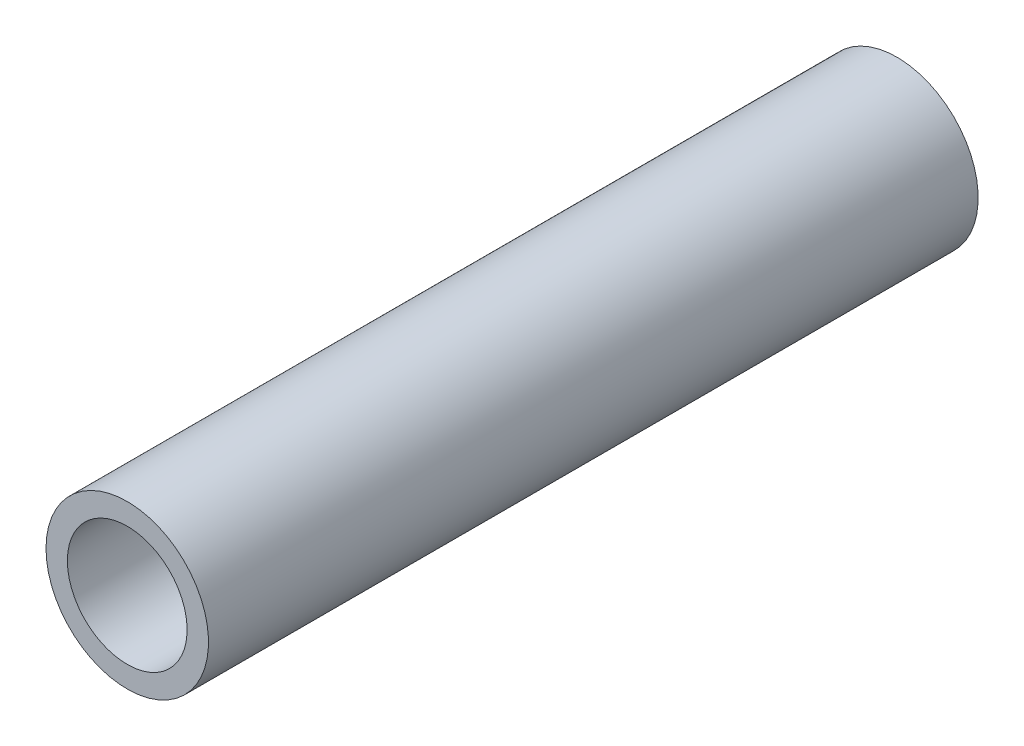
ISO-10303-21;
HEADER;
FILE_DESCRIPTION(('STEP AP214'),'2;1');
FILE_NAME('part.step','',(''),(''),'','','');
FILE_SCHEMA(('AUTOMOTIVE_DESIGN { 1 0 10303 214 1 1 1 1 }'));
ENDSEC;
DATA;
#1=APPLICATION_CONTEXT('core data for automotive mechanical design processes');
#2=APPLICATION_PROTOCOL_DEFINITION('international standard','automotive_design',2000,#1);
#3=PRODUCT_CONTEXT('',#1,'mechanical');
#4=PRODUCT('Part','Part','',(#3));
#5=PRODUCT_RELATED_PRODUCT_CATEGORY('part','',(#4));
#6=PRODUCT_DEFINITION_FORMATION('','',#4);
#7=PRODUCT_DEFINITION_CONTEXT('part definition',#1,'design');
#8=PRODUCT_DEFINITION('design','',#6,#7);
#9=PRODUCT_DEFINITION_SHAPE('','',#8);
#10=(LENGTH_UNIT() NAMED_UNIT(*) SI_UNIT(.MILLI.,.METRE.));
#11=(NAMED_UNIT(*) PLANE_ANGLE_UNIT() SI_UNIT($,.RADIAN.));
#12=(NAMED_UNIT(*) SI_UNIT($,.STERADIAN.) SOLID_ANGLE_UNIT());
#13=UNCERTAINTY_MEASURE_WITH_UNIT(LENGTH_MEASURE(1.E-05),#10,'distance_accuracy_value','');
#14=(GEOMETRIC_REPRESENTATION_CONTEXT(3) GLOBAL_UNCERTAINTY_ASSIGNED_CONTEXT((#13)) GLOBAL_UNIT_ASSIGNED_CONTEXT((#10,
#11,#12)) REPRESENTATION_CONTEXT('',''));
#15=CARTESIAN_POINT('',(0.,0.,0.));
#16=DIRECTION('',(0.,0.,1.));
#17=DIRECTION('',(1.,0.,0.));
#18=AXIS2_PLACEMENT_3D('',#15,#16,#17);
#19=CARTESIAN_POINT('',(0.,0.,90.));
#20=DIRECTION('',(0.,0.,1.));
#21=DIRECTION('',(1.,0.,0.));
#22=AXIS2_PLACEMENT_3D('',#19,#20,#21);
#23=PLANE('',#22);
#24=CARTESIAN_POINT('',(0.,0.,90.));
#25=DIRECTION('',(0.,0.,1.));
#26=DIRECTION('',(1.,0.,0.));
#27=AXIS2_PLACEMENT_3D('',#24,#25,#26);
#28=CIRCLE('',#27,9.5);
#29=CARTESIAN_POINT('',(-9.5,0.,90.));
#30=VERTEX_POINT('',#29);
#31=EDGE_CURVE('E10',#30,#30,#28,.T.);
#32=ORIENTED_EDGE('',*,*,#31,.T.);
#33=EDGE_LOOP('',(#32));
#34=FACE_BOUND('',#33,.T.);
#35=CARTESIAN_POINT('',(0.,0.,90.));
#36=DIRECTION('',(0.,0.,1.));
#37=DIRECTION('',(1.,0.,0.));
#38=AXIS2_PLACEMENT_3D('',#35,#36,#37);
#39=CIRCLE('',#38,7.);
#40=CARTESIAN_POINT('',(-7.,0.,90.));
#41=VERTEX_POINT('',#40);
#42=EDGE_CURVE('E48',#41,#41,#39,.T.);
#43=ORIENTED_EDGE('',*,*,#42,.F.);
#44=EDGE_LOOP('',(#43));
#45=FACE_BOUND('',#44,.T.);
#46=ADVANCED_FACE('F40',(#34,#45),#23,.T.);
#47=CARTESIAN_POINT('',(0.,0.,0.));
#48=DIRECTION('',(0.,0.,1.));
#49=DIRECTION('',(1.,0.,0.));
#50=AXIS2_PLACEMENT_3D('',#47,#48,#49);
#51=PLANE('',#50);
#52=CARTESIAN_POINT('',(0.,0.,0.));
#53=DIRECTION('',(0.,0.,1.));
#54=DIRECTION('',(1.,0.,0.));
#55=AXIS2_PLACEMENT_3D('',#52,#53,#54);
#56=CIRCLE('',#55,9.5);
#57=CARTESIAN_POINT('',(-9.5,0.,0.));
#58=VERTEX_POINT('',#57);
#59=EDGE_CURVE('E41',#58,#58,#56,.T.);
#60=ORIENTED_EDGE('',*,*,#59,.F.);
#61=EDGE_LOOP('',(#60));
#62=FACE_BOUND('',#61,.T.);
#63=CARTESIAN_POINT('',(0.,0.,0.));
#64=DIRECTION('',(0.,0.,1.));
#65=DIRECTION('',(1.,0.,0.));
#66=AXIS2_PLACEMENT_3D('',#63,#64,#65);
#67=CIRCLE('',#66,7.);
#68=CARTESIAN_POINT('',(-7.,0.,0.));
#69=VERTEX_POINT('',#68);
#70=EDGE_CURVE('E49',#69,#69,#67,.T.);
#71=ORIENTED_EDGE('',*,*,#70,.T.);
#72=EDGE_LOOP('',(#71));
#73=FACE_BOUND('',#72,.T.);
#74=ADVANCED_FACE('F58',(#62,#73),#51,.F.);
#75=CARTESIAN_POINT('',(0.,0.,90.));
#76=DIRECTION('',(0.,0.,-1.));
#77=DIRECTION('',(-1.,0.,0.));
#78=AXIS2_PLACEMENT_3D('',#75,#76,#77);
#79=CYLINDRICAL_SURFACE('',#78,9.5);
#80=CARTESIAN_POINT('',(-9.5,0.,90.));
#81=CARTESIAN_POINT('',(-9.5,0.,89.0625));
#82=CARTESIAN_POINT('',(-9.5,0.,88.125));
#83=CARTESIAN_POINT('',(-9.5,0.,86.25));
#84=CARTESIAN_POINT('',(-9.5,0.,85.3125));
#85=CARTESIAN_POINT('',(-9.5,0.,83.4375));
#86=CARTESIAN_POINT('',(-9.5,0.,82.5));
#87=CARTESIAN_POINT('',(-9.5,0.,80.625));
#88=CARTESIAN_POINT('',(-9.5,0.,79.6875));
#89=CARTESIAN_POINT('',(-9.5,0.,77.8125));
#90=CARTESIAN_POINT('',(-9.5,0.,76.875));
#91=CARTESIAN_POINT('',(-9.5,0.,75.));
#92=CARTESIAN_POINT('',(-9.5,0.,74.0625));
#93=CARTESIAN_POINT('',(-9.5,0.,72.1875));
#94=CARTESIAN_POINT('',(-9.5,0.,71.25));
#95=CARTESIAN_POINT('',(-9.5,0.,69.375));
#96=CARTESIAN_POINT('',(-9.5,0.,68.4375));
#97=CARTESIAN_POINT('',(-9.5,0.,66.5625));
#98=CARTESIAN_POINT('',(-9.5,0.,65.625));
#99=CARTESIAN_POINT('',(-9.5,0.,63.75));
#100=CARTESIAN_POINT('',(-9.5,0.,62.8125));
#101=CARTESIAN_POINT('',(-9.5,0.,60.9375));
#102=CARTESIAN_POINT('',(-9.5,0.,60.));
#103=CARTESIAN_POINT('',(-9.5,0.,58.125));
#104=CARTESIAN_POINT('',(-9.5,0.,57.1875));
#105=CARTESIAN_POINT('',(-9.5,0.,55.3125));
#106=CARTESIAN_POINT('',(-9.5,0.,54.375));
#107=CARTESIAN_POINT('',(-9.5,0.,52.5));
#108=CARTESIAN_POINT('',(-9.5,0.,51.5625));
#109=CARTESIAN_POINT('',(-9.5,0.,49.6875));
#110=CARTESIAN_POINT('',(-9.5,0.,48.75));
#111=CARTESIAN_POINT('',(-9.5,0.,46.875));
#112=CARTESIAN_POINT('',(-9.5,0.,45.9375));
#113=CARTESIAN_POINT('',(-9.5,0.,44.0625));
#114=CARTESIAN_POINT('',(-9.5,0.,43.125));
#115=CARTESIAN_POINT('',(-9.5,0.,41.25));
#116=CARTESIAN_POINT('',(-9.5,0.,40.3125));
#117=CARTESIAN_POINT('',(-9.5,0.,38.4375));
#118=CARTESIAN_POINT('',(-9.5,0.,37.5));
#119=CARTESIAN_POINT('',(-9.5,0.,35.625));
#120=CARTESIAN_POINT('',(-9.5,0.,34.6875));
#121=CARTESIAN_POINT('',(-9.5,0.,32.8125));
#122=CARTESIAN_POINT('',(-9.5,0.,31.875));
#123=CARTESIAN_POINT('',(-9.5,0.,30.));
#124=CARTESIAN_POINT('',(-9.5,0.,29.0625));
#125=CARTESIAN_POINT('',(-9.5,0.,27.1875));
#126=CARTESIAN_POINT('',(-9.5,0.,26.25));
#127=CARTESIAN_POINT('',(-9.5,0.,24.375));
#128=CARTESIAN_POINT('',(-9.5,0.,23.4375));
#129=CARTESIAN_POINT('',(-9.5,0.,21.5625));
#130=CARTESIAN_POINT('',(-9.5,0.,20.625));
#131=CARTESIAN_POINT('',(-9.5,0.,18.75));
#132=CARTESIAN_POINT('',(-9.5,0.,17.8125));
#133=CARTESIAN_POINT('',(-9.5,0.,15.9375));
#134=CARTESIAN_POINT('',(-9.5,0.,15.));
#135=CARTESIAN_POINT('',(-9.5,0.,13.125));
#136=CARTESIAN_POINT('',(-9.5,0.,12.1875));
#137=CARTESIAN_POINT('',(-9.5,0.,10.3125));
#138=CARTESIAN_POINT('',(-9.5,0.,9.37499999999999));
#139=CARTESIAN_POINT('',(-9.5,0.,7.49999999999999));
#140=CARTESIAN_POINT('',(-9.5,0.,6.56249999999999));
#141=CARTESIAN_POINT('',(-9.5,0.,4.68749999999999));
#142=CARTESIAN_POINT('',(-9.5,0.,3.74999999999998));
#143=CARTESIAN_POINT('',(-9.5,0.,1.87499999999998));
#144=CARTESIAN_POINT('',(-9.5,0.,0.937499999999986));
#145=CARTESIAN_POINT('',(-9.5,0.,0.));
#146=B_SPLINE_CURVE_WITH_KNOTS('',3,(#80,#81,#82,#83,#84,#85,#86,#87,#88,#89,#90,#91,#92,#93,
#94,#95,#96,#97,#98,#99,#100,#101,#102,#103,#104,#105,#106,#107,#108,#109,#110,#111,#112,#113,
#114,#115,#116,#117,#118,#119,#120,#121,#122,#123,#124,#125,#126,#127,#128,#129,#130,#131,#132,
#133,#134,#135,#136,#137,#138,#139,#140,#141,#142,#143,#144,#145),.UNSPECIFIED.,.F.,.F.,(4,2,2,
2,2,2,2,2,2,2,2,2,2,2,2,2,2,2,2,2,2,2,2,2,2,2,2,2,2,2,2,2,4),(0.,2.81250000000001,
5.62500000000001,8.43750000000001,11.25,14.0625,16.875,19.6875,22.5,25.3125,28.125,30.9375,
33.75,36.5625,39.375,42.1875,45.,47.8125,50.625,53.4375,56.25,59.0625,61.875,64.6875,67.5,
70.3125,73.125,75.9375,78.75,81.5625,84.375,87.1875,90.),.UNSPECIFIED.);
#147=EDGE_CURVE('BSEAM39',#30,#58,#146,.T.);
#148=ORIENTED_EDGE('',*,*,#31,.F.);
#149=ORIENTED_EDGE('',*,*,#59,.T.);
#150=ORIENTED_EDGE('',*,*,#147,.T.);
#151=ORIENTED_EDGE('',*,*,#147,.F.);
#152=EDGE_LOOP('',(#148,#150,#149,#151));
#153=FACE_BOUND('',#152,.T.);
#154=ADVANCED_FACE('F39',(#153),#79,.T.);
#155=CARTESIAN_POINT('',(0.,0.,90.));
#156=DIRECTION('',(0.,0.,-1.));
#157=DIRECTION('',(-1.,0.,0.));
#158=AXIS2_PLACEMENT_3D('',#155,#156,#157);
#159=CYLINDRICAL_SURFACE('',#158,7.);
#160=CARTESIAN_POINT('',(-7.,0.,90.));
#161=CARTESIAN_POINT('',(-7.,0.,89.0625));
#162=CARTESIAN_POINT('',(-7.,0.,88.125));
#163=CARTESIAN_POINT('',(-7.,0.,86.25));
#164=CARTESIAN_POINT('',(-7.,0.,85.3125));
#165=CARTESIAN_POINT('',(-7.,0.,83.4375));
#166=CARTESIAN_POINT('',(-7.,0.,82.5));
#167=CARTESIAN_POINT('',(-7.,0.,80.625));
#168=CARTESIAN_POINT('',(-7.,0.,79.6875));
#169=CARTESIAN_POINT('',(-7.,0.,77.8125));
#170=CARTESIAN_POINT('',(-7.,0.,76.875));
#171=CARTESIAN_POINT('',(-7.,0.,75.));
#172=CARTESIAN_POINT('',(-7.,0.,74.0625));
#173=CARTESIAN_POINT('',(-7.,0.,72.1875));
#174=CARTESIAN_POINT('',(-7.,0.,71.25));
#175=CARTESIAN_POINT('',(-7.,0.,69.375));
#176=CARTESIAN_POINT('',(-7.,0.,68.4375));
#177=CARTESIAN_POINT('',(-7.,0.,66.5625));
#178=CARTESIAN_POINT('',(-7.,0.,65.625));
#179=CARTESIAN_POINT('',(-7.,0.,63.75));
#180=CARTESIAN_POINT('',(-7.,0.,62.8125));
#181=CARTESIAN_POINT('',(-7.,0.,60.9375));
#182=CARTESIAN_POINT('',(-7.,0.,60.));
#183=CARTESIAN_POINT('',(-7.,0.,58.125));
#184=CARTESIAN_POINT('',(-7.,0.,57.1875));
#185=CARTESIAN_POINT('',(-7.,0.,55.3125));
#186=CARTESIAN_POINT('',(-7.,0.,54.375));
#187=CARTESIAN_POINT('',(-7.,0.,52.5));
#188=CARTESIAN_POINT('',(-7.,0.,51.5625));
#189=CARTESIAN_POINT('',(-7.,0.,49.6875));
#190=CARTESIAN_POINT('',(-7.,0.,48.75));
#191=CARTESIAN_POINT('',(-7.,0.,46.875));
#192=CARTESIAN_POINT('',(-7.,0.,45.9375));
#193=CARTESIAN_POINT('',(-7.,0.,44.0625));
#194=CARTESIAN_POINT('',(-7.,0.,43.125));
#195=CARTESIAN_POINT('',(-7.,0.,41.25));
#196=CARTESIAN_POINT('',(-7.,0.,40.3125));
#197=CARTESIAN_POINT('',(-7.,0.,38.4375));
#198=CARTESIAN_POINT('',(-7.,0.,37.5));
#199=CARTESIAN_POINT('',(-7.,0.,35.625));
#200=CARTESIAN_POINT('',(-7.,0.,34.6875));
#201=CARTESIAN_POINT('',(-7.,0.,32.8125));
#202=CARTESIAN_POINT('',(-7.,0.,31.875));
#203=CARTESIAN_POINT('',(-7.,0.,30.));
#204=CARTESIAN_POINT('',(-7.,0.,29.0625));
#205=CARTESIAN_POINT('',(-7.,0.,27.1875));
#206=CARTESIAN_POINT('',(-7.,0.,26.25));
#207=CARTESIAN_POINT('',(-7.,0.,24.375));
#208=CARTESIAN_POINT('',(-7.,0.,23.4375));
#209=CARTESIAN_POINT('',(-7.,0.,21.5625));
#210=CARTESIAN_POINT('',(-7.,0.,20.625));
#211=CARTESIAN_POINT('',(-7.,0.,18.75));
#212=CARTESIAN_POINT('',(-7.,0.,17.8125));
#213=CARTESIAN_POINT('',(-7.,0.,15.9375));
#214=CARTESIAN_POINT('',(-7.,0.,15.));
#215=CARTESIAN_POINT('',(-7.,0.,13.125));
#216=CARTESIAN_POINT('',(-7.,0.,12.1875));
#217=CARTESIAN_POINT('',(-7.,0.,10.3125));
#218=CARTESIAN_POINT('',(-7.,0.,9.37499999999999));
#219=CARTESIAN_POINT('',(-7.,0.,7.49999999999999));
#220=CARTESIAN_POINT('',(-7.,0.,6.56249999999999));
#221=CARTESIAN_POINT('',(-7.,0.,4.68749999999999));
#222=CARTESIAN_POINT('',(-7.,0.,3.74999999999998));
#223=CARTESIAN_POINT('',(-7.,0.,1.87499999999998));
#224=CARTESIAN_POINT('',(-7.,0.,0.937499999999986));
#225=CARTESIAN_POINT('',(-7.,0.,0.));
#226=B_SPLINE_CURVE_WITH_KNOTS('',3,(#160,#161,#162,#163,#164,#165,#166,#167,#168,#169,#170,
#171,#172,#173,#174,#175,#176,#177,#178,#179,#180,#181,#182,#183,#184,#185,#186,#187,#188,#189,
#190,#191,#192,#193,#194,#195,#196,#197,#198,#199,#200,#201,#202,#203,#204,#205,#206,#207,#208,
#209,#210,#211,#212,#213,#214,#215,#216,#217,#218,#219,#220,#221,#222,#223,#224,#225),
.UNSPECIFIED.,.F.,.F.,(4,2,2,2,2,2,2,2,2,2,2,2,2,2,2,2,2,2,2,2,2,2,2,2,2,2,2,2,2,2,2,2,4),(0.,
2.81250000000001,5.62500000000001,8.43750000000001,11.25,14.0625,16.875,19.6875,22.5,25.3125,
28.125,30.9375,33.75,36.5625,39.375,42.1875,45.,47.8125,50.625,53.4375,56.25,59.0625,61.875,
64.6875,67.5,70.3125,73.125,75.9375,78.75,81.5625,84.375,87.1875,90.),.UNSPECIFIED.);
#227=EDGE_CURVE('BSEAM57',#41,#69,#226,.T.);
#228=ORIENTED_EDGE('',*,*,#42,.T.);
#229=ORIENTED_EDGE('',*,*,#70,.F.);
#230=ORIENTED_EDGE('',*,*,#227,.T.);
#231=ORIENTED_EDGE('',*,*,#227,.F.);
#232=EDGE_LOOP('',(#228,#230,#229,#231));
#233=FACE_BOUND('',#232,.T.);
#234=ADVANCED_FACE('F57',(#233),#159,.F.);
#235=CLOSED_SHELL('',(#46,#74,#154,#234));
#236=MANIFOLD_SOLID_BREP('B2',#235);
#237=ADVANCED_BREP_SHAPE_REPRESENTATION('',(#18,#236),#14);
#238=SHAPE_DEFINITION_REPRESENTATION(#9,#237);
ENDSEC;
END-ISO-10303-21;
